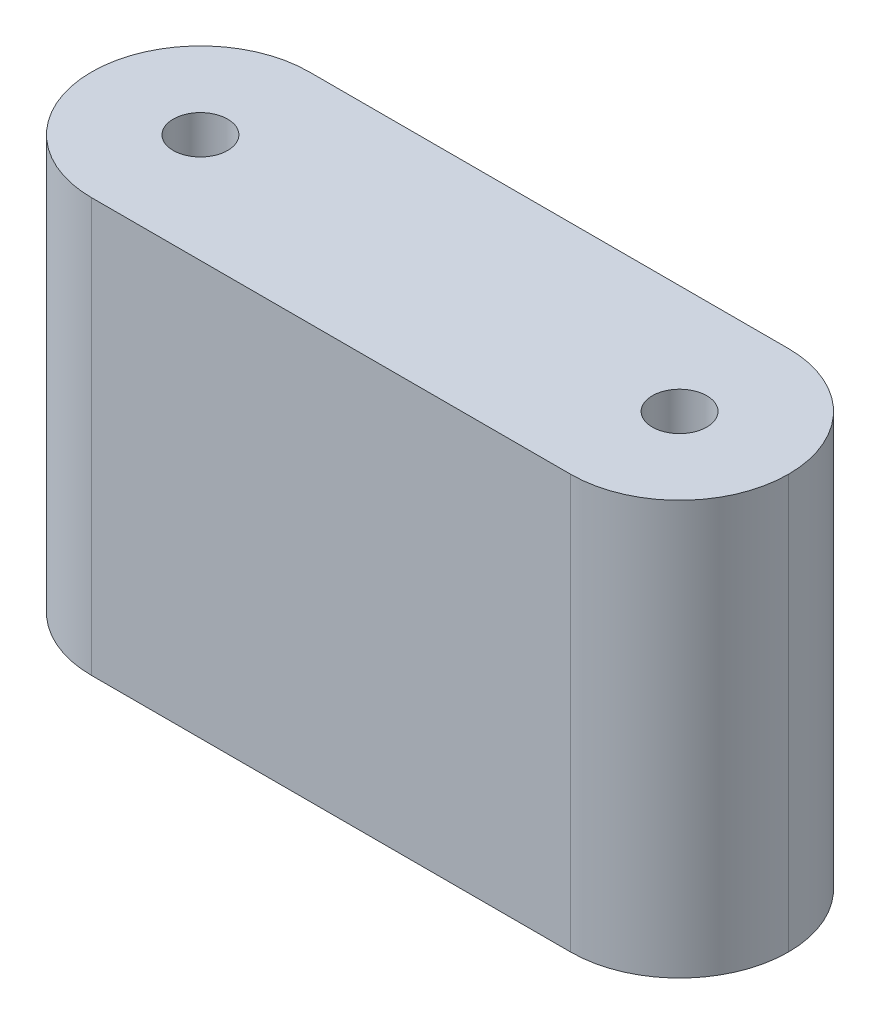
ISO-10303-21;
HEADER;
FILE_DESCRIPTION(('STEP AP214'),'2;1');
FILE_NAME('part.step','',(''),(''),'','','');
FILE_SCHEMA(('AUTOMOTIVE_DESIGN { 1 0 10303 214 1 1 1 1 }'));
ENDSEC;
DATA;
#1=APPLICATION_CONTEXT('core data for automotive mechanical design processes');
#2=APPLICATION_PROTOCOL_DEFINITION('international standard','automotive_design',2000,#1);
#3=PRODUCT_CONTEXT('',#1,'mechanical');
#4=PRODUCT('Part','Part','',(#3));
#5=PRODUCT_RELATED_PRODUCT_CATEGORY('part','',(#4));
#6=PRODUCT_DEFINITION_FORMATION('','',#4);
#7=PRODUCT_DEFINITION_CONTEXT('part definition',#1,'design');
#8=PRODUCT_DEFINITION('design','',#6,#7);
#9=PRODUCT_DEFINITION_SHAPE('','',#8);
#10=(LENGTH_UNIT() NAMED_UNIT(*) SI_UNIT(.MILLI.,.METRE.));
#11=(NAMED_UNIT(*) PLANE_ANGLE_UNIT() SI_UNIT($,.RADIAN.));
#12=(NAMED_UNIT(*) SI_UNIT($,.STERADIAN.) SOLID_ANGLE_UNIT());
#13=UNCERTAINTY_MEASURE_WITH_UNIT(LENGTH_MEASURE(1.E-05),#10,'distance_accuracy_value','');
#14=(GEOMETRIC_REPRESENTATION_CONTEXT(3) GLOBAL_UNCERTAINTY_ASSIGNED_CONTEXT((#13)) GLOBAL_UNIT_ASSIGNED_CONTEXT((#10,
#11,#12)) REPRESENTATION_CONTEXT('',''));
#15=CARTESIAN_POINT('',(0.,0.,0.));
#16=DIRECTION('',(0.,0.,1.));
#17=DIRECTION('',(1.,0.,0.));
#18=AXIS2_PLACEMENT_3D('',#15,#16,#17);
#19=CARTESIAN_POINT('',(0.,18.,0.));
#20=DIRECTION('',(0.,0.,-1.));
#21=DIRECTION('',(-1.,0.,0.));
#22=AXIS2_PLACEMENT_3D('',#19,#20,#21);
#23=PLANE('',#22);
#24=DIRECTION('',(1.,0.,0.));
#25=VECTOR('',#24,1.);
#26=CARTESIAN_POINT('',(0.,0.,0.));
#27=LINE('',#26,#25);
#28=CARTESIAN_POINT('',(5.,0.,0.));
#29=VERTEX_POINT('',#28);
#30=CARTESIAN_POINT('',(27.,0.,0.));
#31=VERTEX_POINT('',#30);
#32=EDGE_CURVE('E102',#29,#31,#27,.T.);
#33=ORIENTED_EDGE('',*,*,#32,.T.);
#34=DIRECTION('',(0.,-1.,0.));
#35=VECTOR('',#34,1.);
#36=CARTESIAN_POINT('',(27.,18.,0.));
#37=LINE('',#36,#35);
#38=CARTESIAN_POINT('',(27.,19.,0.));
#39=VERTEX_POINT('',#38);
#40=EDGE_CURVE('E11',#31,#39,#37,.F.);
#41=ORIENTED_EDGE('',*,*,#40,.T.);
#42=DIRECTION('',(1.,0.,0.));
#43=VECTOR('',#42,1.);
#44=CARTESIAN_POINT('',(0.,19.,0.));
#45=LINE('',#44,#43);
#46=CARTESIAN_POINT('',(5.,19.,0.));
#47=VERTEX_POINT('',#46);
#48=EDGE_CURVE('E153',#47,#39,#45,.T.);
#49=ORIENTED_EDGE('',*,*,#48,.F.);
#50=DIRECTION('',(0.,-1.,0.));
#51=VECTOR('',#50,1.);
#52=CARTESIAN_POINT('',(5.,0.,0.));
#53=LINE('',#52,#51);
#54=EDGE_CURVE('E51',#47,#29,#53,.T.);
#55=ORIENTED_EDGE('',*,*,#54,.T.);
#56=EDGE_LOOP('',(#33,#41,#49,#55));
#57=FACE_BOUND('',#56,.T.);
#58=ADVANCED_FACE('F41',(#57),#23,.F.);
#59=CARTESIAN_POINT('',(0.,18.,-10.));
#60=DIRECTION('',(0.,0.,-1.));
#61=DIRECTION('',(-1.,0.,0.));
#62=AXIS2_PLACEMENT_3D('',#59,#60,#61);
#63=PLANE('',#62);
#64=DIRECTION('',(-1.,0.,0.));
#65=VECTOR('',#64,1.);
#66=CARTESIAN_POINT('',(0.,19.,-10.));
#67=LINE('',#66,#65);
#68=CARTESIAN_POINT('',(27.,19.,-10.));
#69=VERTEX_POINT('',#68);
#70=CARTESIAN_POINT('',(5.,19.,-10.));
#71=VERTEX_POINT('',#70);
#72=EDGE_CURVE('E155',#69,#71,#67,.T.);
#73=ORIENTED_EDGE('',*,*,#72,.F.);
#74=DIRECTION('',(0.,-1.,0.));
#75=VECTOR('',#74,1.);
#76=CARTESIAN_POINT('',(27.,0.,-10.));
#77=LINE('',#76,#75);
#78=CARTESIAN_POINT('',(27.,0.,-10.));
#79=VERTEX_POINT('',#78);
#80=EDGE_CURVE('E109',#69,#79,#77,.T.);
#81=ORIENTED_EDGE('',*,*,#80,.T.);
#82=DIRECTION('',(1.,0.,0.));
#83=VECTOR('',#82,1.);
#84=CARTESIAN_POINT('',(0.,0.,-10.));
#85=LINE('',#84,#83);
#86=CARTESIAN_POINT('',(5.,0.,-10.));
#87=VERTEX_POINT('',#86);
#88=EDGE_CURVE('E168',#87,#79,#85,.T.);
#89=ORIENTED_EDGE('',*,*,#88,.F.);
#90=DIRECTION('',(0.,-1.,0.));
#91=VECTOR('',#90,1.);
#92=CARTESIAN_POINT('',(5.,18.,-10.));
#93=LINE('',#92,#91);
#94=EDGE_CURVE('E119',#87,#71,#93,.F.);
#95=ORIENTED_EDGE('',*,*,#94,.T.);
#96=EDGE_LOOP('',(#73,#81,#89,#95));
#97=FACE_BOUND('',#96,.T.);
#98=ADVANCED_FACE('F205',(#97),#63,.T.);
#99=CARTESIAN_POINT('',(27.,18.,-5.));
#100=DIRECTION('',(0.,-1.,0.));
#101=DIRECTION('',(0.,0.,-1.));
#102=AXIS2_PLACEMENT_3D('',#99,#100,#101);
#103=CYLINDRICAL_SURFACE('',#102,1.25);
#104=CARTESIAN_POINT('',(27.,0.,-5.));
#105=DIRECTION('',(0.,1.,0.));
#106=DIRECTION('',(0.,0.,1.));
#107=AXIS2_PLACEMENT_3D('',#104,#105,#106);
#108=CIRCLE('',#107,1.25);
#109=CARTESIAN_POINT('',(27.,0.,-3.75));
#110=VERTEX_POINT('',#109);
#111=EDGE_CURVE('E128',#110,#110,#108,.F.);
#112=ORIENTED_EDGE('',*,*,#111,.T.);
#113=EDGE_LOOP('',(#112));
#114=FACE_BOUND('',#113,.T.);
#115=CARTESIAN_POINT('',(27.,19.,-5.));
#116=DIRECTION('',(0.,1.,0.));
#117=DIRECTION('',(0.,0.,1.));
#118=AXIS2_PLACEMENT_3D('',#115,#116,#117);
#119=CIRCLE('',#118,1.25);
#120=CARTESIAN_POINT('',(27.,19.,-3.75));
#121=VERTEX_POINT('',#120);
#122=EDGE_CURVE('E162',#121,#121,#119,.T.);
#123=ORIENTED_EDGE('',*,*,#122,.T.);
#124=EDGE_LOOP('',(#123));
#125=FACE_BOUND('',#124,.T.);
#126=ADVANCED_FACE('F174',(#114,#125),#103,.F.);
#127=CARTESIAN_POINT('',(5.,18.,-5.));
#128=DIRECTION('',(0.,-1.,0.));
#129=DIRECTION('',(0.,0.,-1.));
#130=AXIS2_PLACEMENT_3D('',#127,#128,#129);
#131=CYLINDRICAL_SURFACE('',#130,1.25);
#132=CARTESIAN_POINT('',(5.,0.,-5.));
#133=DIRECTION('',(0.,1.,0.));
#134=DIRECTION('',(0.,0.,1.));
#135=AXIS2_PLACEMENT_3D('',#132,#133,#134);
#136=CIRCLE('',#135,1.25);
#137=CARTESIAN_POINT('',(5.,0.,-3.75));
#138=VERTEX_POINT('',#137);
#139=EDGE_CURVE('E124',#138,#138,#136,.T.);
#140=ORIENTED_EDGE('',*,*,#139,.F.);
#141=EDGE_LOOP('',(#140));
#142=FACE_BOUND('',#141,.T.);
#143=CARTESIAN_POINT('',(5.,19.,-5.));
#144=DIRECTION('',(0.,1.,0.));
#145=DIRECTION('',(0.,0.,1.));
#146=AXIS2_PLACEMENT_3D('',#143,#144,#145);
#147=CIRCLE('',#146,1.25);
#148=CARTESIAN_POINT('',(5.,19.,-3.75));
#149=VERTEX_POINT('',#148);
#150=EDGE_CURVE('E156',#149,#149,#147,.T.);
#151=ORIENTED_EDGE('',*,*,#150,.T.);
#152=EDGE_LOOP('',(#151));
#153=FACE_BOUND('',#152,.T.);
#154=ADVANCED_FACE('F179',(#142,#153),#131,.F.);
#155=CARTESIAN_POINT('',(0.,0.,0.));
#156=DIRECTION('',(0.,1.,0.));
#157=DIRECTION('',(0.,0.,1.));
#158=AXIS2_PLACEMENT_3D('',#155,#156,#157);
#159=PLANE('',#158);
#160=ORIENTED_EDGE('',*,*,#88,.T.);
#161=CARTESIAN_POINT('',(27.,0.,-5.));
#162=DIRECTION('',(0.,1.,0.));
#163=DIRECTION('',(0.,0.,1.));
#164=AXIS2_PLACEMENT_3D('',#161,#162,#163);
#165=CIRCLE('',#164,5.);
#166=CARTESIAN_POINT('',(32.,0.,-5.));
#167=VERTEX_POINT('',#166);
#168=EDGE_CURVE('E142',#79,#167,#165,.F.);
#169=ORIENTED_EDGE('',*,*,#168,.T.);
#170=CARTESIAN_POINT('',(27.,0.,-5.));
#171=DIRECTION('',(0.,1.,0.));
#172=DIRECTION('',(0.,0.,1.));
#173=AXIS2_PLACEMENT_3D('',#170,#171,#172);
#174=CIRCLE('',#173,5.);
#175=EDGE_CURVE('E108',#167,#31,#174,.F.);
#176=ORIENTED_EDGE('',*,*,#175,.T.);
#177=ORIENTED_EDGE('',*,*,#32,.F.);
#178=CARTESIAN_POINT('',(5.,0.,-5.));
#179=DIRECTION('',(0.,1.,0.));
#180=DIRECTION('',(0.,0.,1.));
#181=AXIS2_PLACEMENT_3D('',#178,#179,#180);
#182=CIRCLE('',#181,5.);
#183=CARTESIAN_POINT('',(0.,0.,-5.));
#184=VERTEX_POINT('',#183);
#185=EDGE_CURVE('E95',#29,#184,#182,.F.);
#186=ORIENTED_EDGE('',*,*,#185,.T.);
#187=CARTESIAN_POINT('',(5.,0.,-5.));
#188=DIRECTION('',(0.,1.,0.));
#189=DIRECTION('',(0.,0.,1.));
#190=AXIS2_PLACEMENT_3D('',#187,#188,#189);
#191=CIRCLE('',#190,5.);
#192=EDGE_CURVE('E100',#184,#87,#191,.F.);
#193=ORIENTED_EDGE('',*,*,#192,.T.);
#194=EDGE_LOOP('',(#160,#169,#176,#177,#186,#193));
#195=FACE_BOUND('',#194,.T.);
#196=ORIENTED_EDGE('',*,*,#111,.F.);
#197=EDGE_LOOP('',(#196));
#198=FACE_BOUND('',#197,.T.);
#199=ORIENTED_EDGE('',*,*,#139,.T.);
#200=EDGE_LOOP('',(#199));
#201=FACE_BOUND('',#200,.T.);
#202=ADVANCED_FACE('F98',(#195,#198,#201),#159,.F.);
#203=CARTESIAN_POINT('',(0.,19.,0.));
#204=DIRECTION('',(0.,-1.,0.));
#205=DIRECTION('',(0.,0.,-1.));
#206=AXIS2_PLACEMENT_3D('',#203,#204,#205);
#207=PLANE('',#206);
#208=CARTESIAN_POINT('',(27.,19.,-5.));
#209=DIRECTION('',(0.,-1.,0.));
#210=DIRECTION('',(0.,0.,-1.));
#211=AXIS2_PLACEMENT_3D('',#208,#209,#210);
#212=CIRCLE('',#211,5.);
#213=CARTESIAN_POINT('',(32.,19.,-5.));
#214=VERTEX_POINT('',#213);
#215=EDGE_CURVE('E58',#39,#214,#212,.F.);
#216=ORIENTED_EDGE('',*,*,#215,.T.);
#217=CARTESIAN_POINT('',(27.,19.,-5.));
#218=DIRECTION('',(0.,-1.,0.));
#219=DIRECTION('',(0.,0.,-1.));
#220=AXIS2_PLACEMENT_3D('',#217,#218,#219);
#221=CIRCLE('',#220,5.);
#222=EDGE_CURVE('E149',#214,#69,#221,.F.);
#223=ORIENTED_EDGE('',*,*,#222,.T.);
#224=ORIENTED_EDGE('',*,*,#72,.T.);
#225=CARTESIAN_POINT('',(5.,19.,-5.));
#226=DIRECTION('',(0.,-1.,0.));
#227=DIRECTION('',(0.,0.,-1.));
#228=AXIS2_PLACEMENT_3D('',#225,#226,#227);
#229=CIRCLE('',#228,5.);
#230=CARTESIAN_POINT('',(0.,19.,-5.));
#231=VERTEX_POINT('',#230);
#232=EDGE_CURVE('E134',#71,#231,#229,.F.);
#233=ORIENTED_EDGE('',*,*,#232,.T.);
#234=CARTESIAN_POINT('',(5.,19.,-5.));
#235=DIRECTION('',(0.,-1.,0.));
#236=DIRECTION('',(0.,0.,-1.));
#237=AXIS2_PLACEMENT_3D('',#234,#235,#236);
#238=CIRCLE('',#237,5.);
#239=EDGE_CURVE('E122',#231,#47,#238,.F.);
#240=ORIENTED_EDGE('',*,*,#239,.T.);
#241=ORIENTED_EDGE('',*,*,#48,.T.);
#242=EDGE_LOOP('',(#216,#223,#224,#233,#240,#241));
#243=FACE_BOUND('',#242,.T.);
#244=ORIENTED_EDGE('',*,*,#150,.F.);
#245=EDGE_LOOP('',(#244));
#246=FACE_BOUND('',#245,.T.);
#247=ORIENTED_EDGE('',*,*,#122,.F.);
#248=EDGE_LOOP('',(#247));
#249=FACE_BOUND('',#248,.T.);
#250=ADVANCED_FACE('F178',(#243,#246,#249),#207,.F.);
#251=CARTESIAN_POINT('',(5.,18.,-5.));
#252=DIRECTION('',(0.,-1.,0.));
#253=DIRECTION('',(0.,0.,-1.));
#254=AXIS2_PLACEMENT_3D('',#251,#252,#253);
#255=CYLINDRICAL_SURFACE('',#254,5.);
#256=ORIENTED_EDGE('',*,*,#232,.F.);
#257=ORIENTED_EDGE('',*,*,#94,.F.);
#258=ORIENTED_EDGE('',*,*,#192,.F.);
#259=DIRECTION('',(0.,-1.,0.));
#260=VECTOR('',#259,1.);
#261=CARTESIAN_POINT('',(0.,18.,-5.));
#262=LINE('',#261,#260);
#263=EDGE_CURVE('E116',#231,#184,#262,.T.);
#264=ORIENTED_EDGE('',*,*,#263,.F.);
#265=EDGE_LOOP('',(#256,#257,#258,#264));
#266=FACE_BOUND('',#265,.T.);
#267=ADVANCED_FACE('F115',(#266),#255,.T.);
#268=CARTESIAN_POINT('',(27.,18.,-5.));
#269=DIRECTION('',(0.,-1.,0.));
#270=DIRECTION('',(0.,0.,-1.));
#271=AXIS2_PLACEMENT_3D('',#268,#269,#270);
#272=CYLINDRICAL_SURFACE('',#271,5.);
#273=DIRECTION('',(0.,-1.,0.));
#274=VECTOR('',#273,1.);
#275=CARTESIAN_POINT('',(32.,18.,-5.));
#276=LINE('',#275,#274);
#277=EDGE_CURVE('E45',#214,#167,#276,.T.);
#278=ORIENTED_EDGE('',*,*,#277,.F.);
#279=ORIENTED_EDGE('',*,*,#215,.F.);
#280=ORIENTED_EDGE('',*,*,#40,.F.);
#281=ORIENTED_EDGE('',*,*,#175,.F.);
#282=EDGE_LOOP('',(#278,#279,#280,#281));
#283=FACE_BOUND('',#282,.T.);
#284=ADVANCED_FACE('F202',(#283),#272,.T.);
#285=CARTESIAN_POINT('',(27.,18.,-5.));
#286=DIRECTION('',(0.,1.,0.));
#287=DIRECTION('',(0.,0.,1.));
#288=AXIS2_PLACEMENT_3D('',#285,#286,#287);
#289=CYLINDRICAL_SURFACE('',#288,5.);
#290=ORIENTED_EDGE('',*,*,#222,.F.);
#291=ORIENTED_EDGE('',*,*,#277,.T.);
#292=ORIENTED_EDGE('',*,*,#168,.F.);
#293=ORIENTED_EDGE('',*,*,#80,.F.);
#294=EDGE_LOOP('',(#290,#291,#292,#293));
#295=FACE_BOUND('',#294,.T.);
#296=ADVANCED_FACE('F198',(#295),#289,.T.);
#297=CARTESIAN_POINT('',(5.,18.,-5.));
#298=DIRECTION('',(0.,1.,0.));
#299=DIRECTION('',(0.,0.,1.));
#300=AXIS2_PLACEMENT_3D('',#297,#298,#299);
#301=CYLINDRICAL_SURFACE('',#300,5.);
#302=ORIENTED_EDGE('',*,*,#239,.F.);
#303=ORIENTED_EDGE('',*,*,#263,.T.);
#304=ORIENTED_EDGE('',*,*,#185,.F.);
#305=ORIENTED_EDGE('',*,*,#54,.F.);
#306=EDGE_LOOP('',(#302,#303,#304,#305));
#307=FACE_BOUND('',#306,.T.);
#308=ADVANCED_FACE('F43',(#307),#301,.T.);
#309=CLOSED_SHELL('',(#58,#98,#126,#154,#202,#250,#267,#284,#296,#308));
#310=MANIFOLD_SOLID_BREP('B2',#309);
#311=ADVANCED_BREP_SHAPE_REPRESENTATION('',(#18,#310),#14);
#312=SHAPE_DEFINITION_REPRESENTATION(#9,#311);
ENDSEC;
END-ISO-10303-21;
